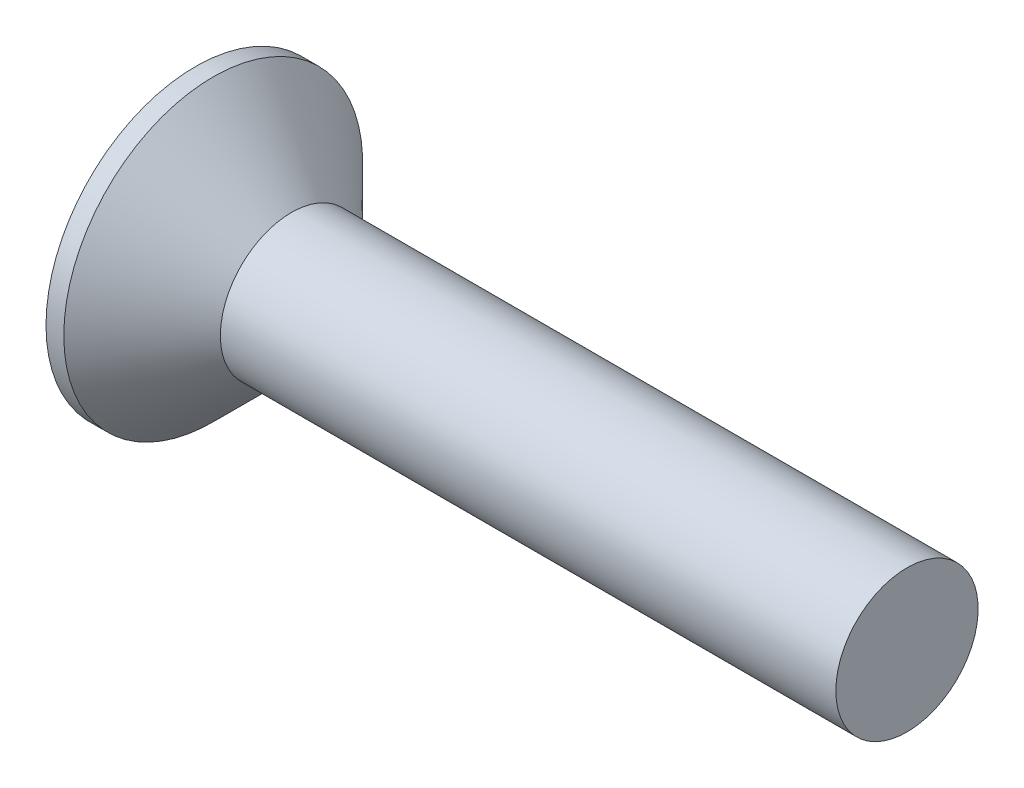
ISO-10303-21;
HEADER;
FILE_DESCRIPTION(('STEP AP214'),'2;1');
FILE_NAME('part.step','',(''),(''),'','','');
FILE_SCHEMA(('AUTOMOTIVE_DESIGN { 1 0 10303 214 1 1 1 1 }'));
ENDSEC;
DATA;
#1=APPLICATION_CONTEXT('core data for automotive mechanical design processes');
#2=APPLICATION_PROTOCOL_DEFINITION('international standard','automotive_design',2000,#1);
#3=PRODUCT_CONTEXT('',#1,'mechanical');
#4=PRODUCT('Part','Part','',(#3));
#5=PRODUCT_RELATED_PRODUCT_CATEGORY('part','',(#4));
#6=PRODUCT_DEFINITION_FORMATION('','',#4);
#7=PRODUCT_DEFINITION_CONTEXT('part definition',#1,'design');
#8=PRODUCT_DEFINITION('design','',#6,#7);
#9=PRODUCT_DEFINITION_SHAPE('','',#8);
#10=(LENGTH_UNIT() NAMED_UNIT(*) SI_UNIT(.MILLI.,.METRE.));
#11=(NAMED_UNIT(*) PLANE_ANGLE_UNIT() SI_UNIT($,.RADIAN.));
#12=(NAMED_UNIT(*) SI_UNIT($,.STERADIAN.) SOLID_ANGLE_UNIT());
#13=UNCERTAINTY_MEASURE_WITH_UNIT(LENGTH_MEASURE(1.E-05),#10,'distance_accuracy_value','');
#14=(GEOMETRIC_REPRESENTATION_CONTEXT(3) GLOBAL_UNCERTAINTY_ASSIGNED_CONTEXT((#13)) GLOBAL_UNIT_ASSIGNED_CONTEXT((#10,
#11,#12)) REPRESENTATION_CONTEXT('',''));
#15=CARTESIAN_POINT('',(0.,0.,0.));
#16=DIRECTION('',(0.,0.,1.));
#17=DIRECTION('',(1.,0.,0.));
#18=AXIS2_PLACEMENT_3D('',#15,#16,#17);
#19=CARTESIAN_POINT('',(0.,0.,0.));
#20=DIRECTION('',(-1.,0.,0.));
#21=DIRECTION('',(0.,0.,1.));
#22=AXIS2_PLACEMENT_3D('',#19,#20,#21);
#23=PLANE('',#22);
#24=CARTESIAN_POINT('',(0.,0.,0.));
#25=DIRECTION('',(-1.,0.,0.));
#26=DIRECTION('',(0.,0.,1.));
#27=AXIS2_PLACEMENT_3D('',#24,#25,#26);
#28=CIRCLE('',#27,4.2);
#29=CARTESIAN_POINT('',(0.,0.,4.2));
#30=VERTEX_POINT('',#29);
#31=EDGE_CURVE('E59',#30,#30,#28,.T.);
#32=ORIENTED_EDGE('',*,*,#31,.T.);
#33=EDGE_LOOP('',(#32));
#34=FACE_BOUND('',#33,.T.);
#35=DIRECTION('',(0.,1.,0.));
#36=VECTOR('',#35,1.);
#37=CARTESIAN_POINT('',(0.,-2.23,-0.48));
#38=LINE('',#37,#36);
#39=CARTESIAN_POINT('',(0.,-2.23,-0.48));
#40=VERTEX_POINT('',#39);
#41=CARTESIAN_POINT('',(0.,-0.479999999999998,-0.48));
#42=VERTEX_POINT('',#41);
#43=EDGE_CURVE('E121',#40,#42,#38,.T.);
#44=ORIENTED_EDGE('',*,*,#43,.T.);
#45=DIRECTION('',(0.,0.,-1.));
#46=VECTOR('',#45,1.);
#47=CARTESIAN_POINT('',(0.,-0.480000000000007,2.23));
#48=LINE('',#47,#46);
#49=CARTESIAN_POINT('',(0.,-0.479999999999992,-2.23));
#50=VERTEX_POINT('',#49);
#51=EDGE_CURVE('E100',#42,#50,#48,.T.);
#52=ORIENTED_EDGE('',*,*,#51,.T.);
#53=DIRECTION('',(0.,1.,0.));
#54=VECTOR('',#53,1.);
#55=CARTESIAN_POINT('',(0.,-0.479999999999992,-2.23));
#56=LINE('',#55,#54);
#57=CARTESIAN_POINT('',(0.,0.480000000000008,-2.23));
#58=VERTEX_POINT('',#57);
#59=EDGE_CURVE('E413',#50,#58,#56,.T.);
#60=ORIENTED_EDGE('',*,*,#59,.T.);
#61=DIRECTION('',(0.,0.,1.));
#62=VECTOR('',#61,1.);
#63=CARTESIAN_POINT('',(0.,0.480000000000008,-2.23));
#64=LINE('',#63,#62);
#65=CARTESIAN_POINT('',(0.,0.480000000000002,-0.48));
#66=VERTEX_POINT('',#65);
#67=EDGE_CURVE('E116',#58,#66,#64,.T.);
#68=ORIENTED_EDGE('',*,*,#67,.T.);
#69=CARTESIAN_POINT('',(0.,2.23,-0.48));
#70=VERTEX_POINT('',#69);
#71=EDGE_CURVE('E110',#66,#70,#38,.T.);
#72=ORIENTED_EDGE('',*,*,#71,.T.);
#73=DIRECTION('',(0.,0.,1.));
#74=VECTOR('',#73,1.);
#75=CARTESIAN_POINT('',(0.,2.23,-0.48));
#76=LINE('',#75,#74);
#77=CARTESIAN_POINT('',(0.,2.23,0.48));
#78=VERTEX_POINT('',#77);
#79=EDGE_CURVE('E113',#70,#78,#76,.T.);
#80=ORIENTED_EDGE('',*,*,#79,.T.);
#81=DIRECTION('',(0.,-1.,0.));
#82=VECTOR('',#81,1.);
#83=CARTESIAN_POINT('',(0.,2.23,0.48));
#84=LINE('',#83,#82);
#85=CARTESIAN_POINT('',(0.,0.479999999999998,0.48));
#86=VERTEX_POINT('',#85);
#87=EDGE_CURVE('E432',#78,#86,#84,.T.);
#88=ORIENTED_EDGE('',*,*,#87,.T.);
#89=CARTESIAN_POINT('',(0.,0.479999999999992,2.23));
#90=VERTEX_POINT('',#89);
#91=EDGE_CURVE('E403',#86,#90,#64,.T.);
#92=ORIENTED_EDGE('',*,*,#91,.T.);
#93=DIRECTION('',(0.,-1.,0.));
#94=VECTOR('',#93,1.);
#95=CARTESIAN_POINT('',(0.,0.479999999999992,2.23));
#96=LINE('',#95,#94);
#97=CARTESIAN_POINT('',(0.,-0.480000000000007,2.23));
#98=VERTEX_POINT('',#97);
#99=EDGE_CURVE('E388',#90,#98,#96,.T.);
#100=ORIENTED_EDGE('',*,*,#99,.T.);
#101=CARTESIAN_POINT('',(0.,-0.480000000000002,0.48));
#102=VERTEX_POINT('',#101);
#103=EDGE_CURVE('E401',#98,#102,#48,.T.);
#104=ORIENTED_EDGE('',*,*,#103,.T.);
#105=CARTESIAN_POINT('',(0.,-2.23,0.48));
#106=VERTEX_POINT('',#105);
#107=EDGE_CURVE('E128',#102,#106,#84,.T.);
#108=ORIENTED_EDGE('',*,*,#107,.T.);
#109=DIRECTION('',(0.,0.,-1.));
#110=VECTOR('',#109,1.);
#111=CARTESIAN_POINT('',(0.,-2.23,0.48));
#112=LINE('',#111,#110);
#113=EDGE_CURVE('E159',#106,#40,#112,.T.);
#114=ORIENTED_EDGE('',*,*,#113,.T.);
#115=EDGE_LOOP('',(#44,#52,#60,#68,#72,#80,#88,#92,#100,#104,#108,#114));
#116=FACE_BOUND('',#115,.T.);
#117=ADVANCED_FACE('F51',(#34,#116),#23,.T.);
#118=CARTESIAN_POINT('',(2.96959798994975,0.,0.21105527638191));
#119=DIRECTION('',(-0.0901968863789278,0.,-0.995923953767328));
#120=DIRECTION('',(-0.995923953767328,0.,0.0901968863789278));
#121=AXIS2_PLACEMENT_3D('',#118,#119,#120);
#122=PLANE('',#121);
#123=ORIENTED_EDGE('',*,*,#107,.F.);
#124=DIRECTION('',(0.991897347093265,0.0898322125669375,-0.0898322125669372));
#125=VECTOR('',#124,1.);
#126=CARTESIAN_POINT('',(2.98840392964726,-0.209352096937608,0.209352096937607));
#127=LINE('',#126,#125);
#128=CARTESIAN_POINT('',(2.65,-0.240000000000001,0.239999999999999));
#129=VERTEX_POINT('',#128);
#130=EDGE_CURVE('E153',#102,#129,#127,.T.);
#131=ORIENTED_EDGE('',*,*,#130,.T.);
#132=DIRECTION('',(0.797549052549738,0.59891419417886,-0.0722308575894103));
#133=VECTOR('',#132,1.);
#134=CARTESIAN_POINT('',(0.,-2.23,0.48));
#135=LINE('',#134,#133);
#136=EDGE_CURVE('E122',#106,#129,#135,.T.);
#137=ORIENTED_EDGE('',*,*,#136,.F.);
#138=EDGE_LOOP('',(#123,#131,#137));
#139=FACE_BOUND('',#138,.T.);
#140=ADVANCED_FACE('F186',(#139),#122,.T.);
#141=DIRECTION('',(0.797549052549738,-0.59891419417886,-0.0722308575894101));
#142=VECTOR('',#141,1.);
#143=CARTESIAN_POINT('',(0.,2.23,0.48));
#144=LINE('',#143,#142);
#145=CARTESIAN_POINT('',(2.65,0.24,0.24));
#146=VERTEX_POINT('',#145);
#147=EDGE_CURVE('E66',#78,#146,#144,.T.);
#148=ORIENTED_EDGE('',*,*,#147,.T.);
#149=DIRECTION('',(-0.991897347093265,0.0898322125669368,0.0898322125669372));
#150=VECTOR('',#149,1.);
#151=CARTESIAN_POINT('',(2.98840392964726,0.209352096937606,0.209352096937607));
#152=LINE('',#151,#150);
#153=EDGE_CURVE('E426',#146,#86,#152,.T.);
#154=ORIENTED_EDGE('',*,*,#153,.T.);
#155=ORIENTED_EDGE('',*,*,#87,.F.);
#156=EDGE_LOOP('',(#148,#154,#155));
#157=FACE_BOUND('',#156,.T.);
#158=ADVANCED_FACE('F190',(#157),#122,.T.);
#159=CARTESIAN_POINT('',(2.96959798994975,0.,-0.21105527638191));
#160=DIRECTION('',(-0.0901968863789278,0.,0.995923953767328));
#161=DIRECTION('',(0.995923953767328,0.,0.0901968863789278));
#162=AXIS2_PLACEMENT_3D('',#159,#160,#161);
#163=PLANE('',#162);
#164=DIRECTION('',(0.797549052549738,0.59891419417886,0.0722308575894102));
#165=VECTOR('',#164,1.);
#166=CARTESIAN_POINT('',(0.,-2.23,-0.48));
#167=LINE('',#166,#165);
#168=CARTESIAN_POINT('',(2.65,-0.239999999999999,-0.240000000000001));
#169=VERTEX_POINT('',#168);
#170=EDGE_CURVE('E75',#40,#169,#167,.T.);
#171=ORIENTED_EDGE('',*,*,#170,.T.);
#172=DIRECTION('',(-0.991897347093265,-0.0898322125669369,-0.0898322125669372));
#173=VECTOR('',#172,1.);
#174=CARTESIAN_POINT('',(2.98840392964725,-0.209352096937606,-0.209352096937607));
#175=LINE('',#174,#173);
#176=EDGE_CURVE('E13',#169,#42,#175,.T.);
#177=ORIENTED_EDGE('',*,*,#176,.T.);
#178=ORIENTED_EDGE('',*,*,#43,.F.);
#179=EDGE_LOOP('',(#171,#177,#178));
#180=FACE_BOUND('',#179,.T.);
#181=ADVANCED_FACE('F183',(#180),#163,.T.);
#182=ORIENTED_EDGE('',*,*,#71,.F.);
#183=DIRECTION('',(0.991897347093265,-0.0898322125669375,0.0898322125669372));
#184=VECTOR('',#183,1.);
#185=CARTESIAN_POINT('',(2.98840392964726,0.209352096937608,-0.209352096937607));
#186=LINE('',#185,#184);
#187=CARTESIAN_POINT('',(2.65,0.24,-0.24));
#188=VERTEX_POINT('',#187);
#189=EDGE_CURVE('E131',#66,#188,#186,.T.);
#190=ORIENTED_EDGE('',*,*,#189,.T.);
#191=DIRECTION('',(0.797549052549738,-0.59891419417886,0.0722308575894102));
#192=VECTOR('',#191,1.);
#193=CARTESIAN_POINT('',(0.,2.23,-0.48));
#194=LINE('',#193,#192);
#195=EDGE_CURVE('E126',#70,#188,#194,.T.);
#196=ORIENTED_EDGE('',*,*,#195,.F.);
#197=EDGE_LOOP('',(#182,#190,#196));
#198=FACE_BOUND('',#197,.T.);
#199=ADVANCED_FACE('F130',(#198),#163,.T.);
#200=CARTESIAN_POINT('',(-6.34999999999999,0.,0.));
#201=DIRECTION('',(-1.,0.,0.));
#202=DIRECTION('',(0.,0.,1.));
#203=AXIS2_PLACEMENT_3D('',#200,#201,#202);
#204=CYLINDRICAL_SURFACE('',#203,4.2);
#205=CARTESIAN_POINT('',(0.500000000000007,0.,0.));
#206=DIRECTION('',(-1.,0.,0.));
#207=DIRECTION('',(0.,0.,1.));
#208=AXIS2_PLACEMENT_3D('',#205,#206,#207);
#209=CIRCLE('',#208,4.2);
#210=CARTESIAN_POINT('',(0.500000000000007,0.,4.2));
#211=VERTEX_POINT('',#210);
#212=EDGE_CURVE('E163',#211,#211,#209,.T.);
#213=ORIENTED_EDGE('',*,*,#212,.T.);
#214=EDGE_LOOP('',(#213));
#215=FACE_BOUND('',#214,.T.);
#216=ORIENTED_EDGE('',*,*,#31,.F.);
#217=EDGE_LOOP('',(#216));
#218=FACE_BOUND('',#217,.T.);
#219=ADVANCED_FACE('F172',(#215,#218),#204,.T.);
#220=CARTESIAN_POINT('',(0.500000000000007,0.,0.));
#221=DIRECTION('',(-1.,0.,0.));
#222=DIRECTION('',(0.,0.,1.));
#223=AXIS2_PLACEMENT_3D('',#220,#221,#222);
#224=CONICAL_SURFACE('',#223,4.2,0.78539816339745);
#225=CARTESIAN_POINT('',(2.7,0.,0.));
#226=DIRECTION('',(-1.,0.,0.));
#227=DIRECTION('',(0.,0.,1.));
#228=AXIS2_PLACEMENT_3D('',#225,#226,#227);
#229=CIRCLE('',#228,2.);
#230=CARTESIAN_POINT('',(2.7,0.,2.));
#231=VERTEX_POINT('',#230);
#232=EDGE_CURVE('E158',#231,#231,#229,.T.);
#233=ORIENTED_EDGE('',*,*,#232,.T.);
#234=EDGE_LOOP('',(#233));
#235=FACE_BOUND('',#234,.T.);
#236=ORIENTED_EDGE('',*,*,#212,.F.);
#237=EDGE_LOOP('',(#236));
#238=FACE_BOUND('',#237,.T.);
#239=ADVANCED_FACE('F174',(#235,#238),#224,.T.);
#240=CARTESIAN_POINT('',(-6.34999999999999,0.,0.));
#241=DIRECTION('',(-1.,0.,0.));
#242=DIRECTION('',(0.,0.,1.));
#243=AXIS2_PLACEMENT_3D('',#240,#241,#242);
#244=CYLINDRICAL_SURFACE('',#243,2.);
#245=CARTESIAN_POINT('',(20.,0.,0.));
#246=DIRECTION('',(-1.,0.,0.));
#247=DIRECTION('',(0.,0.,1.));
#248=AXIS2_PLACEMENT_3D('',#245,#246,#247);
#249=CIRCLE('',#248,2.);
#250=CARTESIAN_POINT('',(20.,0.,2.));
#251=VERTEX_POINT('',#250);
#252=EDGE_CURVE('E154',#251,#251,#249,.T.);
#253=ORIENTED_EDGE('',*,*,#252,.T.);
#254=EDGE_LOOP('',(#253));
#255=FACE_BOUND('',#254,.T.);
#256=ORIENTED_EDGE('',*,*,#232,.F.);
#257=EDGE_LOOP('',(#256));
#258=FACE_BOUND('',#257,.T.);
#259=ADVANCED_FACE('F180',(#255,#258),#244,.T.);
#260=CARTESIAN_POINT('',(20.,2.,0.));
#261=DIRECTION('',(1.,0.,0.));
#262=DIRECTION('',(0.,0.,-1.));
#263=AXIS2_PLACEMENT_3D('',#260,#261,#262);
#264=PLANE('',#263);
#265=ORIENTED_EDGE('',*,*,#252,.F.);
#266=EDGE_LOOP('',(#265));
#267=FACE_BOUND('',#266,.T.);
#268=ADVANCED_FACE('F210',(#267),#264,.T.);
#269=CARTESIAN_POINT('',(2.65,0.24,-0.24));
#270=DIRECTION('',(1.,0.,0.));
#271=DIRECTION('',(0.,0.,-1.));
#272=AXIS2_PLACEMENT_3D('',#269,#270,#271);
#273=PLANE('',#272);
#274=DIRECTION('',(0.,1.,0.));
#275=VECTOR('',#274,1.);
#276=CARTESIAN_POINT('',(2.65,-0.24,-0.24));
#277=LINE('',#276,#275);
#278=EDGE_CURVE('E147',#169,#188,#277,.T.);
#279=ORIENTED_EDGE('',*,*,#278,.F.);
#280=DIRECTION('',(0.,0.,-1.));
#281=VECTOR('',#280,1.);
#282=CARTESIAN_POINT('',(2.65,-0.24,0.24));
#283=LINE('',#282,#281);
#284=EDGE_CURVE('E134',#129,#169,#283,.T.);
#285=ORIENTED_EDGE('',*,*,#284,.F.);
#286=DIRECTION('',(0.,-1.,0.));
#287=VECTOR('',#286,1.);
#288=CARTESIAN_POINT('',(2.65,0.24,0.24));
#289=LINE('',#288,#287);
#290=EDGE_CURVE('E140',#146,#129,#289,.T.);
#291=ORIENTED_EDGE('',*,*,#290,.F.);
#292=DIRECTION('',(0.,0.,1.));
#293=VECTOR('',#292,1.);
#294=CARTESIAN_POINT('',(2.65,0.24,-0.24));
#295=LINE('',#294,#293);
#296=EDGE_CURVE('E144',#188,#146,#295,.T.);
#297=ORIENTED_EDGE('',*,*,#296,.F.);
#298=EDGE_LOOP('',(#279,#285,#291,#297));
#299=FACE_BOUND('',#298,.T.);
#300=ADVANCED_FACE('F207',(#299),#273,.F.);
#301=CARTESIAN_POINT('',(0.,-2.23,-0.48));
#302=DIRECTION('',(-0.600482690889725,0.799637754199885,0.));
#303=DIRECTION('',(-0.799637754199885,-0.600482690889725,0.));
#304=AXIS2_PLACEMENT_3D('',#301,#302,#303);
#305=PLANE('',#304);
#306=ORIENTED_EDGE('',*,*,#170,.F.);
#307=ORIENTED_EDGE('',*,*,#113,.F.);
#308=ORIENTED_EDGE('',*,*,#136,.T.);
#309=ORIENTED_EDGE('',*,*,#284,.T.);
#310=EDGE_LOOP('',(#306,#307,#308,#309));
#311=FACE_BOUND('',#310,.T.);
#312=ADVANCED_FACE('F199',(#311),#305,.T.);
#313=CARTESIAN_POINT('',(2.65,0.24,0.24));
#314=DIRECTION('',(-0.600482690889725,-0.799637754199885,0.));
#315=DIRECTION('',(0.799637754199885,-0.600482690889725,0.));
#316=AXIS2_PLACEMENT_3D('',#313,#314,#315);
#317=PLANE('',#316);
#318=ORIENTED_EDGE('',*,*,#147,.F.);
#319=ORIENTED_EDGE('',*,*,#79,.F.);
#320=ORIENTED_EDGE('',*,*,#195,.T.);
#321=ORIENTED_EDGE('',*,*,#296,.T.);
#322=EDGE_LOOP('',(#318,#319,#320,#321));
#323=FACE_BOUND('',#322,.T.);
#324=ADVANCED_FACE('F125',(#323),#317,.T.);
#325=CARTESIAN_POINT('',(2.96959798994975,-0.21105527638191,0.));
#326=DIRECTION('',(-0.0901968863789278,0.995923953767328,0.));
#327=DIRECTION('',(-0.995923953767328,-0.0901968863789278,0.));
#328=AXIS2_PLACEMENT_3D('',#325,#326,#327);
#329=PLANE('',#328);
#330=DIRECTION('',(0.797549052549738,0.0722308575894082,0.59891419417886));
#331=VECTOR('',#330,1.);
#332=CARTESIAN_POINT('',(0.,-0.479999999999992,-2.23));
#333=LINE('',#332,#331);
#334=EDGE_CURVE('E416',#50,#169,#333,.T.);
#335=ORIENTED_EDGE('',*,*,#334,.F.);
#336=ORIENTED_EDGE('',*,*,#51,.F.);
#337=ORIENTED_EDGE('',*,*,#176,.F.);
#338=EDGE_LOOP('',(#335,#336,#337));
#339=FACE_BOUND('',#338,.T.);
#340=ADVANCED_FACE('F206',(#339),#329,.T.);
#341=CARTESIAN_POINT('',(2.96959798994975,0.21105527638191,0.));
#342=DIRECTION('',(-0.0901968863789278,-0.995923953767328,0.));
#343=DIRECTION('',(0.995923953767328,-0.0901968863789278,0.));
#344=AXIS2_PLACEMENT_3D('',#341,#342,#343);
#345=PLANE('',#344);
#346=ORIENTED_EDGE('',*,*,#67,.F.);
#347=DIRECTION('',(0.797549052549738,-0.0722308575894123,0.59891419417886));
#348=VECTOR('',#347,1.);
#349=CARTESIAN_POINT('',(0.,0.480000000000008,-2.23));
#350=LINE('',#349,#348);
#351=EDGE_CURVE('E91',#58,#188,#350,.T.);
#352=ORIENTED_EDGE('',*,*,#351,.T.);
#353=ORIENTED_EDGE('',*,*,#189,.F.);
#354=EDGE_LOOP('',(#346,#352,#353));
#355=FACE_BOUND('',#354,.T.);
#356=ADVANCED_FACE('F249',(#355),#345,.T.);
#357=CARTESIAN_POINT('',(0.,0.480000000000008,-2.23));
#358=DIRECTION('',(-0.600482690889725,0.,0.799637754199885));
#359=DIRECTION('',(-0.799637754199885,0.,-0.600482690889725));
#360=AXIS2_PLACEMENT_3D('',#357,#358,#359);
#361=PLANE('',#360);
#362=ORIENTED_EDGE('',*,*,#351,.F.);
#363=ORIENTED_EDGE('',*,*,#59,.F.);
#364=ORIENTED_EDGE('',*,*,#334,.T.);
#365=ORIENTED_EDGE('',*,*,#278,.T.);
#366=EDGE_LOOP('',(#362,#363,#364,#365));
#367=FACE_BOUND('',#366,.T.);
#368=ADVANCED_FACE('F257',(#367),#361,.T.);
#369=ORIENTED_EDGE('',*,*,#103,.F.);
#370=DIRECTION('',(0.797549052549738,0.0722308575894122,-0.59891419417886));
#371=VECTOR('',#370,1.);
#372=CARTESIAN_POINT('',(0.,-0.480000000000007,2.23));
#373=LINE('',#372,#371);
#374=EDGE_CURVE('E385',#98,#129,#373,.T.);
#375=ORIENTED_EDGE('',*,*,#374,.T.);
#376=ORIENTED_EDGE('',*,*,#130,.F.);
#377=EDGE_LOOP('',(#369,#375,#376));
#378=FACE_BOUND('',#377,.T.);
#379=ADVANCED_FACE('F251',(#378),#329,.T.);
#380=DIRECTION('',(0.797549052549738,-0.0722308575894081,-0.59891419417886));
#381=VECTOR('',#380,1.);
#382=CARTESIAN_POINT('',(0.,0.479999999999992,2.23));
#383=LINE('',#382,#381);
#384=EDGE_CURVE('E397',#90,#146,#383,.T.);
#385=ORIENTED_EDGE('',*,*,#384,.F.);
#386=ORIENTED_EDGE('',*,*,#91,.F.);
#387=ORIENTED_EDGE('',*,*,#153,.F.);
#388=EDGE_LOOP('',(#385,#386,#387));
#389=FACE_BOUND('',#388,.T.);
#390=ADVANCED_FACE('F259',(#389),#345,.T.);
#391=CARTESIAN_POINT('',(2.65,-0.240000000000001,0.239999999999999));
#392=DIRECTION('',(-0.600482690889725,0.,-0.799637754199885));
#393=DIRECTION('',(0.799637754199885,0.,-0.600482690889725));
#394=AXIS2_PLACEMENT_3D('',#391,#392,#393);
#395=PLANE('',#394);
#396=ORIENTED_EDGE('',*,*,#374,.F.);
#397=ORIENTED_EDGE('',*,*,#99,.F.);
#398=ORIENTED_EDGE('',*,*,#384,.T.);
#399=ORIENTED_EDGE('',*,*,#290,.T.);
#400=EDGE_LOOP('',(#396,#397,#398,#399));
#401=FACE_BOUND('',#400,.T.);
#402=ADVANCED_FACE('F278',(#401),#395,.T.);
#403=CLOSED_SHELL('',(#117,#140,#158,#181,#199,#219,#239,#259,#268,#300,#312,#324,#340,#356,
#368,#379,#390,#402));
#404=MANIFOLD_SOLID_BREP('B2',#403);
#405=ADVANCED_BREP_SHAPE_REPRESENTATION('',(#18,#404),#14);
#406=SHAPE_DEFINITION_REPRESENTATION(#9,#405);
ENDSEC;
END-ISO-10303-21;
